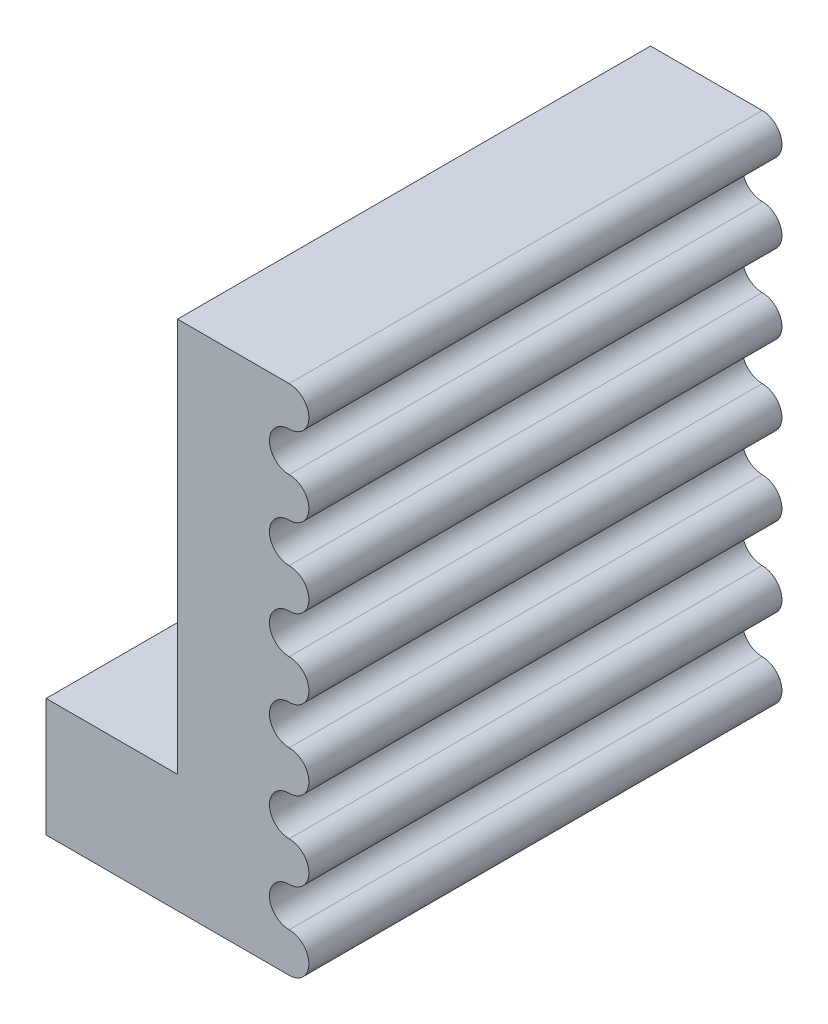
ISO-10303-21;
HEADER;
FILE_DESCRIPTION(('STEP AP214'),'2;1');
FILE_NAME('part.step','',(''),(''),'','','');
FILE_SCHEMA(('AUTOMOTIVE_DESIGN { 1 0 10303 214 1 1 1 1 }'));
ENDSEC;
DATA;
#1=APPLICATION_CONTEXT('core data for automotive mechanical design processes');
#2=APPLICATION_PROTOCOL_DEFINITION('international standard','automotive_design',2000,#1);
#3=PRODUCT_CONTEXT('',#1,'mechanical');
#4=PRODUCT('Part','Part','',(#3));
#5=PRODUCT_RELATED_PRODUCT_CATEGORY('part','',(#4));
#6=PRODUCT_DEFINITION_FORMATION('','',#4);
#7=PRODUCT_DEFINITION_CONTEXT('part definition',#1,'design');
#8=PRODUCT_DEFINITION('design','',#6,#7);
#9=PRODUCT_DEFINITION_SHAPE('','',#8);
#10=(LENGTH_UNIT() NAMED_UNIT(*) SI_UNIT(.MILLI.,.METRE.));
#11=(NAMED_UNIT(*) PLANE_ANGLE_UNIT() SI_UNIT($,.RADIAN.));
#12=(NAMED_UNIT(*) SI_UNIT($,.STERADIAN.) SOLID_ANGLE_UNIT());
#13=UNCERTAINTY_MEASURE_WITH_UNIT(LENGTH_MEASURE(1.E-05),#10,'distance_accuracy_value','');
#14=(GEOMETRIC_REPRESENTATION_CONTEXT(3) GLOBAL_UNCERTAINTY_ASSIGNED_CONTEXT((#13)) GLOBAL_UNIT_ASSIGNED_CONTEXT((#10,
#11,#12)) REPRESENTATION_CONTEXT('',''));
#15=CARTESIAN_POINT('',(0.,0.,0.));
#16=DIRECTION('',(0.,0.,1.));
#17=DIRECTION('',(1.,0.,0.));
#18=AXIS2_PLACEMENT_3D('',#15,#16,#17);
#19=CARTESIAN_POINT('',(9.25000000000023,17.25,18.));
#20=DIRECTION('',(0.,0.,-1.));
#21=DIRECTION('',(-1.,0.,0.));
#22=AXIS2_PLACEMENT_3D('',#19,#20,#21);
#23=CYLINDRICAL_SURFACE('',#22,0.750000000000001);
#24=CARTESIAN_POINT('',(9.25000000000023,17.25,0.));
#25=DIRECTION('',(0.,0.,-1.));
#26=DIRECTION('',(1.,0.,0.));
#27=AXIS2_PLACEMENT_3D('',#24,#25,#26);
#28=CIRCLE('',#27,0.750000000000001);
#29=CARTESIAN_POINT('',(9.25000000000023,16.5,0.));
#30=VERTEX_POINT('',#29);
#31=CARTESIAN_POINT('',(9.25000000000023,18.,0.));
#32=VERTEX_POINT('',#31);
#33=EDGE_CURVE('E191',#30,#32,#28,.T.);
#34=ORIENTED_EDGE('',*,*,#33,.T.);
#35=DIRECTION('',(0.,0.,-1.));
#36=VECTOR('',#35,1.);
#37=CARTESIAN_POINT('',(9.25000000000023,18.,18.));
#38=LINE('',#37,#36);
#39=CARTESIAN_POINT('',(9.25000000000023,18.,18.));
#40=VERTEX_POINT('',#39);
#41=EDGE_CURVE('E11',#40,#32,#38,.T.);
#42=ORIENTED_EDGE('',*,*,#41,.F.);
#43=CARTESIAN_POINT('',(9.25000000000023,17.25,18.));
#44=DIRECTION('',(0.,0.,-1.));
#45=DIRECTION('',(1.,0.,0.));
#46=AXIS2_PLACEMENT_3D('',#43,#44,#45);
#47=CIRCLE('',#46,0.750000000000001);
#48=CARTESIAN_POINT('',(9.25000000000023,16.5,18.));
#49=VERTEX_POINT('',#48);
#50=EDGE_CURVE('E225',#49,#40,#47,.T.);
#51=ORIENTED_EDGE('',*,*,#50,.F.);
#52=DIRECTION('',(0.,0.,-1.));
#53=VECTOR('',#52,1.);
#54=CARTESIAN_POINT('',(9.25000000000023,16.5,18.));
#55=LINE('',#54,#53);
#56=EDGE_CURVE('E187',#49,#30,#55,.T.);
#57=ORIENTED_EDGE('',*,*,#56,.T.);
#58=EDGE_LOOP('',(#34,#42,#51,#57));
#59=FACE_BOUND('',#58,.T.);
#60=ADVANCED_FACE('F35',(#59),#23,.F.);
#61=CARTESIAN_POINT('',(9.25000000000023,18.75,18.));
#62=DIRECTION('',(0.,0.,-1.));
#63=DIRECTION('',(-1.,0.,0.));
#64=AXIS2_PLACEMENT_3D('',#61,#62,#63);
#65=CYLINDRICAL_SURFACE('',#64,0.750000000000001);
#66=CARTESIAN_POINT('',(9.25000000000023,18.75,0.));
#67=DIRECTION('',(0.,0.,1.));
#68=DIRECTION('',(1.,0.,0.));
#69=AXIS2_PLACEMENT_3D('',#66,#67,#68);
#70=CIRCLE('',#69,0.750000000000001);
#71=CARTESIAN_POINT('',(9.25000000000023,19.5,0.));
#72=VERTEX_POINT('',#71);
#73=EDGE_CURVE('E194',#32,#72,#70,.T.);
#74=ORIENTED_EDGE('',*,*,#73,.T.);
#75=DIRECTION('',(0.,0.,-1.));
#76=VECTOR('',#75,1.);
#77=CARTESIAN_POINT('',(9.25000000000023,19.5,18.));
#78=LINE('',#77,#76);
#79=CARTESIAN_POINT('',(9.25000000000023,19.5,18.));
#80=VERTEX_POINT('',#79);
#81=EDGE_CURVE('E43',#80,#72,#78,.T.);
#82=ORIENTED_EDGE('',*,*,#81,.F.);
#83=CARTESIAN_POINT('',(9.25000000000023,18.75,18.));
#84=DIRECTION('',(0.,0.,1.));
#85=DIRECTION('',(1.,0.,0.));
#86=AXIS2_PLACEMENT_3D('',#83,#84,#85);
#87=CIRCLE('',#86,0.750000000000001);
#88=EDGE_CURVE('E124',#40,#80,#87,.T.);
#89=ORIENTED_EDGE('',*,*,#88,.F.);
#90=ORIENTED_EDGE('',*,*,#41,.T.);
#91=EDGE_LOOP('',(#74,#82,#89,#90));
#92=FACE_BOUND('',#91,.T.);
#93=ADVANCED_FACE('F333',(#92),#65,.T.);
#94=CARTESIAN_POINT('',(5.,19.5,18.));
#95=DIRECTION('',(0.,-1.,0.));
#96=DIRECTION('',(0.,0.,-1.));
#97=AXIS2_PLACEMENT_3D('',#94,#95,#96);
#98=PLANE('',#97);
#99=DIRECTION('',(-1.,0.,0.));
#100=VECTOR('',#99,1.);
#101=CARTESIAN_POINT('',(5.,19.5,0.));
#102=LINE('',#101,#100);
#103=CARTESIAN_POINT('',(5.,19.5,0.));
#104=VERTEX_POINT('',#103);
#105=EDGE_CURVE('E196',#72,#104,#102,.T.);
#106=ORIENTED_EDGE('',*,*,#105,.T.);
#107=DIRECTION('',(0.,0.,-1.));
#108=VECTOR('',#107,1.);
#109=CARTESIAN_POINT('',(5.,19.5,18.));
#110=LINE('',#109,#108);
#111=CARTESIAN_POINT('',(5.,19.5,18.));
#112=VERTEX_POINT('',#111);
#113=EDGE_CURVE('E262',#112,#104,#110,.T.);
#114=ORIENTED_EDGE('',*,*,#113,.F.);
#115=DIRECTION('',(-1.,0.,0.));
#116=VECTOR('',#115,1.);
#117=CARTESIAN_POINT('',(5.,19.5,18.));
#118=LINE('',#117,#116);
#119=EDGE_CURVE('E270',#80,#112,#118,.T.);
#120=ORIENTED_EDGE('',*,*,#119,.F.);
#121=ORIENTED_EDGE('',*,*,#81,.T.);
#122=EDGE_LOOP('',(#106,#114,#120,#121));
#123=FACE_BOUND('',#122,.T.);
#124=ADVANCED_FACE('F268',(#123),#98,.F.);
#125=CARTESIAN_POINT('',(5.,4.49999999999993,18.));
#126=DIRECTION('',(1.,0.,0.));
#127=DIRECTION('',(0.,0.,-1.));
#128=AXIS2_PLACEMENT_3D('',#125,#126,#127);
#129=PLANE('',#128);
#130=DIRECTION('',(0.,-1.,0.));
#131=VECTOR('',#130,1.);
#132=CARTESIAN_POINT('',(5.,4.49999999999993,0.));
#133=LINE('',#132,#131);
#134=CARTESIAN_POINT('',(5.,4.49999999999993,0.));
#135=VERTEX_POINT('',#134);
#136=EDGE_CURVE('E198',#104,#135,#133,.T.);
#137=ORIENTED_EDGE('',*,*,#136,.T.);
#138=DIRECTION('',(0.,0.,-1.));
#139=VECTOR('',#138,1.);
#140=CARTESIAN_POINT('',(5.,4.49999999999993,18.));
#141=LINE('',#140,#139);
#142=CARTESIAN_POINT('',(5.,4.49999999999993,18.));
#143=VERTEX_POINT('',#142);
#144=EDGE_CURVE('E259',#143,#135,#141,.T.);
#145=ORIENTED_EDGE('',*,*,#144,.F.);
#146=DIRECTION('',(0.,-1.,0.));
#147=VECTOR('',#146,1.);
#148=CARTESIAN_POINT('',(5.,4.49999999999993,18.));
#149=LINE('',#148,#147);
#150=EDGE_CURVE('E288',#112,#143,#149,.T.);
#151=ORIENTED_EDGE('',*,*,#150,.F.);
#152=ORIENTED_EDGE('',*,*,#113,.T.);
#153=EDGE_LOOP('',(#137,#145,#151,#152));
#154=FACE_BOUND('',#153,.T.);
#155=ADVANCED_FACE('F279',(#154),#129,.F.);
#156=CARTESIAN_POINT('',(0.,4.49999999999993,18.));
#157=DIRECTION('',(0.,-1.,0.));
#158=DIRECTION('',(0.,0.,-1.));
#159=AXIS2_PLACEMENT_3D('',#156,#157,#158);
#160=PLANE('',#159);
#161=DIRECTION('',(-1.,0.,0.));
#162=VECTOR('',#161,1.);
#163=CARTESIAN_POINT('',(0.,4.49999999999993,0.));
#164=LINE('',#163,#162);
#165=CARTESIAN_POINT('',(0.,4.49999999999993,0.));
#166=VERTEX_POINT('',#165);
#167=EDGE_CURVE('E200',#135,#166,#164,.T.);
#168=ORIENTED_EDGE('',*,*,#167,.T.);
#169=DIRECTION('',(0.,0.,-1.));
#170=VECTOR('',#169,1.);
#171=CARTESIAN_POINT('',(0.,4.49999999999993,18.));
#172=LINE('',#171,#170);
#173=CARTESIAN_POINT('',(0.,4.49999999999993,18.));
#174=VERTEX_POINT('',#173);
#175=EDGE_CURVE('E256',#174,#166,#172,.T.);
#176=ORIENTED_EDGE('',*,*,#175,.F.);
#177=DIRECTION('',(-1.,0.,0.));
#178=VECTOR('',#177,1.);
#179=CARTESIAN_POINT('',(0.,4.49999999999993,18.));
#180=LINE('',#179,#178);
#181=EDGE_CURVE('E285',#143,#174,#180,.T.);
#182=ORIENTED_EDGE('',*,*,#181,.F.);
#183=ORIENTED_EDGE('',*,*,#144,.T.);
#184=EDGE_LOOP('',(#168,#176,#182,#183));
#185=FACE_BOUND('',#184,.T.);
#186=ADVANCED_FACE('F283',(#185),#160,.F.);
#187=CARTESIAN_POINT('',(0.,0.,18.));
#188=DIRECTION('',(1.,0.,0.));
#189=DIRECTION('',(0.,0.,-1.));
#190=AXIS2_PLACEMENT_3D('',#187,#188,#189);
#191=PLANE('',#190);
#192=DIRECTION('',(0.,-1.,0.));
#193=VECTOR('',#192,1.);
#194=CARTESIAN_POINT('',(0.,0.,0.));
#195=LINE('',#194,#193);
#196=CARTESIAN_POINT('',(0.,0.,0.));
#197=VERTEX_POINT('',#196);
#198=EDGE_CURVE('E202',#166,#197,#195,.T.);
#199=ORIENTED_EDGE('',*,*,#198,.T.);
#200=DIRECTION('',(0.,0.,-1.));
#201=VECTOR('',#200,1.);
#202=CARTESIAN_POINT('',(0.,0.,18.));
#203=LINE('',#202,#201);
#204=CARTESIAN_POINT('',(0.,0.,18.));
#205=VERTEX_POINT('',#204);
#206=EDGE_CURVE('E253',#205,#197,#203,.T.);
#207=ORIENTED_EDGE('',*,*,#206,.F.);
#208=DIRECTION('',(0.,-1.,0.));
#209=VECTOR('',#208,1.);
#210=CARTESIAN_POINT('',(0.,0.,18.));
#211=LINE('',#210,#209);
#212=EDGE_CURVE('E287',#174,#205,#211,.T.);
#213=ORIENTED_EDGE('',*,*,#212,.F.);
#214=ORIENTED_EDGE('',*,*,#175,.T.);
#215=EDGE_LOOP('',(#199,#207,#213,#214));
#216=FACE_BOUND('',#215,.T.);
#217=ADVANCED_FACE('F346',(#216),#191,.F.);
#218=CARTESIAN_POINT('',(9.25000000000023,0.,18.));
#219=DIRECTION('',(0.,1.,0.));
#220=DIRECTION('',(0.,0.,1.));
#221=AXIS2_PLACEMENT_3D('',#218,#219,#220);
#222=PLANE('',#221);
#223=DIRECTION('',(1.,0.,0.));
#224=VECTOR('',#223,1.);
#225=CARTESIAN_POINT('',(9.25000000000023,0.,0.));
#226=LINE('',#225,#224);
#227=CARTESIAN_POINT('',(9.25000000000023,0.,0.));
#228=VERTEX_POINT('',#227);
#229=EDGE_CURVE('E204',#197,#228,#226,.T.);
#230=ORIENTED_EDGE('',*,*,#229,.T.);
#231=DIRECTION('',(0.,0.,-1.));
#232=VECTOR('',#231,1.);
#233=CARTESIAN_POINT('',(9.25000000000023,0.,18.));
#234=LINE('',#233,#232);
#235=CARTESIAN_POINT('',(9.25000000000023,0.,18.));
#236=VERTEX_POINT('',#235);
#237=EDGE_CURVE('E250',#236,#228,#234,.T.);
#238=ORIENTED_EDGE('',*,*,#237,.F.);
#239=DIRECTION('',(1.,0.,0.));
#240=VECTOR('',#239,1.);
#241=CARTESIAN_POINT('',(9.25000000000023,0.,18.));
#242=LINE('',#241,#240);
#243=EDGE_CURVE('E290',#205,#236,#242,.T.);
#244=ORIENTED_EDGE('',*,*,#243,.F.);
#245=ORIENTED_EDGE('',*,*,#206,.T.);
#246=EDGE_LOOP('',(#230,#238,#244,#245));
#247=FACE_BOUND('',#246,.T.);
#248=ADVANCED_FACE('F349',(#247),#222,.F.);
#249=CARTESIAN_POINT('',(9.25000000000023,0.750000000000001,18.));
#250=DIRECTION('',(0.,0.,-1.));
#251=DIRECTION('',(-1.,0.,0.));
#252=AXIS2_PLACEMENT_3D('',#249,#250,#251);
#253=CYLINDRICAL_SURFACE('',#252,0.750000000000001);
#254=CARTESIAN_POINT('',(9.25000000000023,0.750000000000001,0.));
#255=DIRECTION('',(0.,0.,1.));
#256=DIRECTION('',(1.,0.,0.));
#257=AXIS2_PLACEMENT_3D('',#254,#255,#256);
#258=CIRCLE('',#257,0.750000000000001);
#259=CARTESIAN_POINT('',(9.25000000000023,1.5,0.));
#260=VERTEX_POINT('',#259);
#261=EDGE_CURVE('E206',#228,#260,#258,.T.);
#262=ORIENTED_EDGE('',*,*,#261,.T.);
#263=DIRECTION('',(0.,0.,-1.));
#264=VECTOR('',#263,1.);
#265=CARTESIAN_POINT('',(9.25000000000023,1.5,18.));
#266=LINE('',#265,#264);
#267=CARTESIAN_POINT('',(9.25000000000023,1.5,18.));
#268=VERTEX_POINT('',#267);
#269=EDGE_CURVE('E247',#268,#260,#266,.T.);
#270=ORIENTED_EDGE('',*,*,#269,.F.);
#271=CARTESIAN_POINT('',(9.25000000000023,0.750000000000001,18.));
#272=DIRECTION('',(0.,0.,1.));
#273=DIRECTION('',(1.,0.,0.));
#274=AXIS2_PLACEMENT_3D('',#271,#272,#273);
#275=CIRCLE('',#274,0.750000000000001);
#276=EDGE_CURVE('E296',#236,#268,#275,.T.);
#277=ORIENTED_EDGE('',*,*,#276,.F.);
#278=ORIENTED_EDGE('',*,*,#237,.T.);
#279=EDGE_LOOP('',(#262,#270,#277,#278));
#280=FACE_BOUND('',#279,.T.);
#281=ADVANCED_FACE('F353',(#280),#253,.T.);
#282=CARTESIAN_POINT('',(9.25000000000023,2.25,18.));
#283=DIRECTION('',(0.,0.,-1.));
#284=DIRECTION('',(-1.,0.,0.));
#285=AXIS2_PLACEMENT_3D('',#282,#283,#284);
#286=CYLINDRICAL_SURFACE('',#285,0.750000000000001);
#287=CARTESIAN_POINT('',(9.25000000000023,2.25,0.));
#288=DIRECTION('',(0.,0.,-1.));
#289=DIRECTION('',(1.,0.,0.));
#290=AXIS2_PLACEMENT_3D('',#287,#288,#289);
#291=CIRCLE('',#290,0.750000000000001);
#292=CARTESIAN_POINT('',(9.25000000000023,3.,0.));
#293=VERTEX_POINT('',#292);
#294=EDGE_CURVE('E208',#260,#293,#291,.T.);
#295=ORIENTED_EDGE('',*,*,#294,.T.);
#296=DIRECTION('',(0.,0.,-1.));
#297=VECTOR('',#296,1.);
#298=CARTESIAN_POINT('',(9.25000000000023,3.,18.));
#299=LINE('',#298,#297);
#300=CARTESIAN_POINT('',(9.25000000000023,3.,18.));
#301=VERTEX_POINT('',#300);
#302=EDGE_CURVE('E244',#301,#293,#299,.T.);
#303=ORIENTED_EDGE('',*,*,#302,.F.);
#304=CARTESIAN_POINT('',(9.25000000000023,2.25,18.));
#305=DIRECTION('',(0.,0.,-1.));
#306=DIRECTION('',(1.,0.,0.));
#307=AXIS2_PLACEMENT_3D('',#304,#305,#306);
#308=CIRCLE('',#307,0.750000000000001);
#309=EDGE_CURVE('E298',#268,#301,#308,.T.);
#310=ORIENTED_EDGE('',*,*,#309,.F.);
#311=ORIENTED_EDGE('',*,*,#269,.T.);
#312=EDGE_LOOP('',(#295,#303,#310,#311));
#313=FACE_BOUND('',#312,.T.);
#314=ADVANCED_FACE('F357',(#313),#286,.F.);
#315=CARTESIAN_POINT('',(9.25000000000023,3.75,18.));
#316=DIRECTION('',(0.,0.,-1.));
#317=DIRECTION('',(-1.,0.,0.));
#318=AXIS2_PLACEMENT_3D('',#315,#316,#317);
#319=CYLINDRICAL_SURFACE('',#318,0.75);
#320=CARTESIAN_POINT('',(9.25000000000023,3.75,0.));
#321=DIRECTION('',(0.,0.,1.));
#322=DIRECTION('',(1.,0.,0.));
#323=AXIS2_PLACEMENT_3D('',#320,#321,#322);
#324=CIRCLE('',#323,0.75);
#325=CARTESIAN_POINT('',(9.25000000000023,4.5,0.));
#326=VERTEX_POINT('',#325);
#327=EDGE_CURVE('E210',#293,#326,#324,.T.);
#328=ORIENTED_EDGE('',*,*,#327,.T.);
#329=DIRECTION('',(0.,0.,-1.));
#330=VECTOR('',#329,1.);
#331=CARTESIAN_POINT('',(9.25000000000023,4.5,18.));
#332=LINE('',#331,#330);
#333=CARTESIAN_POINT('',(9.25000000000023,4.5,18.));
#334=VERTEX_POINT('',#333);
#335=EDGE_CURVE('E241',#334,#326,#332,.T.);
#336=ORIENTED_EDGE('',*,*,#335,.F.);
#337=CARTESIAN_POINT('',(9.25000000000023,3.75,18.));
#338=DIRECTION('',(0.,0.,1.));
#339=DIRECTION('',(1.,0.,0.));
#340=AXIS2_PLACEMENT_3D('',#337,#338,#339);
#341=CIRCLE('',#340,0.75);
#342=EDGE_CURVE('E300',#301,#334,#341,.T.);
#343=ORIENTED_EDGE('',*,*,#342,.F.);
#344=ORIENTED_EDGE('',*,*,#302,.T.);
#345=EDGE_LOOP('',(#328,#336,#343,#344));
#346=FACE_BOUND('',#345,.T.);
#347=ADVANCED_FACE('F361',(#346),#319,.T.);
#348=CARTESIAN_POINT('',(9.2500000000002,5.25,18.));
#349=DIRECTION('',(0.,0.,-1.));
#350=DIRECTION('',(-1.,0.,0.));
#351=AXIS2_PLACEMENT_3D('',#348,#349,#350);
#352=CYLINDRICAL_SURFACE('',#351,0.750000000000001);
#353=CARTESIAN_POINT('',(9.2500000000002,5.25,0.));
#354=DIRECTION('',(0.,0.,-1.));
#355=DIRECTION('',(1.,0.,0.));
#356=AXIS2_PLACEMENT_3D('',#353,#354,#355);
#357=CIRCLE('',#356,0.750000000000001);
#358=CARTESIAN_POINT('',(9.25000000000023,6.,0.));
#359=VERTEX_POINT('',#358);
#360=EDGE_CURVE('E212',#326,#359,#357,.T.);
#361=ORIENTED_EDGE('',*,*,#360,.T.);
#362=DIRECTION('',(0.,0.,-1.));
#363=VECTOR('',#362,1.);
#364=CARTESIAN_POINT('',(9.25000000000023,6.,18.));
#365=LINE('',#364,#363);
#366=CARTESIAN_POINT('',(9.25000000000023,6.,18.));
#367=VERTEX_POINT('',#366);
#368=EDGE_CURVE('E238',#367,#359,#365,.T.);
#369=ORIENTED_EDGE('',*,*,#368,.F.);
#370=CARTESIAN_POINT('',(9.2500000000002,5.25,18.));
#371=DIRECTION('',(0.,0.,-1.));
#372=DIRECTION('',(1.,0.,0.));
#373=AXIS2_PLACEMENT_3D('',#370,#371,#372);
#374=CIRCLE('',#373,0.750000000000001);
#375=EDGE_CURVE('E302',#334,#367,#374,.T.);
#376=ORIENTED_EDGE('',*,*,#375,.F.);
#377=ORIENTED_EDGE('',*,*,#335,.T.);
#378=EDGE_LOOP('',(#361,#369,#376,#377));
#379=FACE_BOUND('',#378,.T.);
#380=ADVANCED_FACE('F365',(#379),#352,.F.);
#381=CARTESIAN_POINT('',(9.25000000000023,6.75000000000001,18.));
#382=DIRECTION('',(0.,0.,-1.));
#383=DIRECTION('',(-1.,0.,0.));
#384=AXIS2_PLACEMENT_3D('',#381,#382,#383);
#385=CYLINDRICAL_SURFACE('',#384,0.750000000000001);
#386=CARTESIAN_POINT('',(9.25000000000023,6.75000000000001,0.));
#387=DIRECTION('',(0.,0.,1.));
#388=DIRECTION('',(1.,0.,0.));
#389=AXIS2_PLACEMENT_3D('',#386,#387,#388);
#390=CIRCLE('',#389,0.750000000000001);
#391=CARTESIAN_POINT('',(9.25000000000023,7.50000000000001,0.));
#392=VERTEX_POINT('',#391);
#393=EDGE_CURVE('E214',#359,#392,#390,.T.);
#394=ORIENTED_EDGE('',*,*,#393,.T.);
#395=DIRECTION('',(0.,0.,-1.));
#396=VECTOR('',#395,1.);
#397=CARTESIAN_POINT('',(9.25000000000023,7.50000000000001,18.));
#398=LINE('',#397,#396);
#399=CARTESIAN_POINT('',(9.25000000000023,7.50000000000001,18.));
#400=VERTEX_POINT('',#399);
#401=EDGE_CURVE('E235',#400,#392,#398,.T.);
#402=ORIENTED_EDGE('',*,*,#401,.F.);
#403=CARTESIAN_POINT('',(9.25000000000023,6.75000000000001,18.));
#404=DIRECTION('',(0.,0.,1.));
#405=DIRECTION('',(1.,0.,0.));
#406=AXIS2_PLACEMENT_3D('',#403,#404,#405);
#407=CIRCLE('',#406,0.750000000000001);
#408=EDGE_CURVE('E304',#367,#400,#407,.T.);
#409=ORIENTED_EDGE('',*,*,#408,.F.);
#410=ORIENTED_EDGE('',*,*,#368,.T.);
#411=EDGE_LOOP('',(#394,#402,#409,#410));
#412=FACE_BOUND('',#411,.T.);
#413=ADVANCED_FACE('F369',(#412),#385,.T.);
#414=CARTESIAN_POINT('',(9.25000000000023,8.25000000000001,18.));
#415=DIRECTION('',(0.,0.,-1.));
#416=DIRECTION('',(-1.,0.,0.));
#417=AXIS2_PLACEMENT_3D('',#414,#415,#416);
#418=CYLINDRICAL_SURFACE('',#417,0.750000000000001);
#419=CARTESIAN_POINT('',(9.25000000000023,8.25000000000001,0.));
#420=DIRECTION('',(0.,0.,-1.));
#421=DIRECTION('',(1.,0.,0.));
#422=AXIS2_PLACEMENT_3D('',#419,#420,#421);
#423=CIRCLE('',#422,0.750000000000001);
#424=CARTESIAN_POINT('',(9.25000000000023,9.00000000000001,0.));
#425=VERTEX_POINT('',#424);
#426=EDGE_CURVE('E216',#392,#425,#423,.T.);
#427=ORIENTED_EDGE('',*,*,#426,.T.);
#428=DIRECTION('',(0.,0.,-1.));
#429=VECTOR('',#428,1.);
#430=CARTESIAN_POINT('',(9.25000000000023,9.00000000000001,18.));
#431=LINE('',#430,#429);
#432=CARTESIAN_POINT('',(9.25000000000023,9.00000000000001,18.));
#433=VERTEX_POINT('',#432);
#434=EDGE_CURVE('E232',#433,#425,#431,.T.);
#435=ORIENTED_EDGE('',*,*,#434,.F.);
#436=CARTESIAN_POINT('',(9.25000000000023,8.25000000000001,18.));
#437=DIRECTION('',(0.,0.,-1.));
#438=DIRECTION('',(1.,0.,0.));
#439=AXIS2_PLACEMENT_3D('',#436,#437,#438);
#440=CIRCLE('',#439,0.750000000000001);
#441=EDGE_CURVE('E306',#400,#433,#440,.T.);
#442=ORIENTED_EDGE('',*,*,#441,.F.);
#443=ORIENTED_EDGE('',*,*,#401,.T.);
#444=EDGE_LOOP('',(#427,#435,#442,#443));
#445=FACE_BOUND('',#444,.T.);
#446=ADVANCED_FACE('F373',(#445),#418,.F.);
#447=CARTESIAN_POINT('',(9.25000000000023,9.75000000000001,18.));
#448=DIRECTION('',(0.,0.,-1.));
#449=DIRECTION('',(-1.,0.,0.));
#450=AXIS2_PLACEMENT_3D('',#447,#448,#449);
#451=CYLINDRICAL_SURFACE('',#450,0.750000000000001);
#452=CARTESIAN_POINT('',(9.25000000000023,9.75000000000001,0.));
#453=DIRECTION('',(0.,0.,1.));
#454=DIRECTION('',(1.,0.,0.));
#455=AXIS2_PLACEMENT_3D('',#452,#453,#454);
#456=CIRCLE('',#455,0.750000000000001);
#457=CARTESIAN_POINT('',(9.25000000000023,10.5,0.));
#458=VERTEX_POINT('',#457);
#459=EDGE_CURVE('E218',#425,#458,#456,.T.);
#460=ORIENTED_EDGE('',*,*,#459,.T.);
#461=DIRECTION('',(0.,0.,-1.));
#462=VECTOR('',#461,1.);
#463=CARTESIAN_POINT('',(9.25000000000023,10.5,18.));
#464=LINE('',#463,#462);
#465=CARTESIAN_POINT('',(9.25000000000023,10.5,18.));
#466=VERTEX_POINT('',#465);
#467=EDGE_CURVE('E229',#466,#458,#464,.T.);
#468=ORIENTED_EDGE('',*,*,#467,.F.);
#469=CARTESIAN_POINT('',(9.25000000000023,9.75000000000001,18.));
#470=DIRECTION('',(0.,0.,1.));
#471=DIRECTION('',(1.,0.,0.));
#472=AXIS2_PLACEMENT_3D('',#469,#470,#471);
#473=CIRCLE('',#472,0.750000000000001);
#474=EDGE_CURVE('E308',#433,#466,#473,.T.);
#475=ORIENTED_EDGE('',*,*,#474,.F.);
#476=ORIENTED_EDGE('',*,*,#434,.T.);
#477=EDGE_LOOP('',(#460,#468,#475,#476));
#478=FACE_BOUND('',#477,.T.);
#479=ADVANCED_FACE('F314',(#478),#451,.T.);
#480=CARTESIAN_POINT('',(9.25000000000023,11.25,18.));
#481=DIRECTION('',(0.,0.,-1.));
#482=DIRECTION('',(-1.,0.,0.));
#483=AXIS2_PLACEMENT_3D('',#480,#481,#482);
#484=CYLINDRICAL_SURFACE('',#483,0.750000000000001);
#485=CARTESIAN_POINT('',(9.25000000000023,11.25,0.));
#486=DIRECTION('',(0.,0.,-1.));
#487=DIRECTION('',(1.,0.,0.));
#488=AXIS2_PLACEMENT_3D('',#485,#486,#487);
#489=CIRCLE('',#488,0.750000000000001);
#490=CARTESIAN_POINT('',(9.25000000000023,12.,0.));
#491=VERTEX_POINT('',#490);
#492=EDGE_CURVE('E220',#458,#491,#489,.T.);
#493=ORIENTED_EDGE('',*,*,#492,.T.);
#494=DIRECTION('',(0.,0.,-1.));
#495=VECTOR('',#494,1.);
#496=CARTESIAN_POINT('',(9.25000000000023,12.,18.));
#497=LINE('',#496,#495);
#498=CARTESIAN_POINT('',(9.25000000000023,12.,18.));
#499=VERTEX_POINT('',#498);
#500=EDGE_CURVE('E182',#499,#491,#497,.T.);
#501=ORIENTED_EDGE('',*,*,#500,.F.);
#502=CARTESIAN_POINT('',(9.25000000000023,11.25,18.));
#503=DIRECTION('',(0.,0.,-1.));
#504=DIRECTION('',(1.,0.,0.));
#505=AXIS2_PLACEMENT_3D('',#502,#503,#504);
#506=CIRCLE('',#505,0.750000000000001);
#507=EDGE_CURVE('E173',#466,#499,#506,.T.);
#508=ORIENTED_EDGE('',*,*,#507,.F.);
#509=ORIENTED_EDGE('',*,*,#467,.T.);
#510=EDGE_LOOP('',(#493,#501,#508,#509));
#511=FACE_BOUND('',#510,.T.);
#512=ADVANCED_FACE('F318',(#511),#484,.F.);
#513=CARTESIAN_POINT('',(9.25000000000023,12.75,18.));
#514=DIRECTION('',(0.,0.,-1.));
#515=DIRECTION('',(-1.,0.,0.));
#516=AXIS2_PLACEMENT_3D('',#513,#514,#515);
#517=CYLINDRICAL_SURFACE('',#516,0.750000000000001);
#518=CARTESIAN_POINT('',(9.25000000000023,12.75,0.));
#519=DIRECTION('',(0.,0.,1.));
#520=DIRECTION('',(1.,0.,0.));
#521=AXIS2_PLACEMENT_3D('',#518,#519,#520);
#522=CIRCLE('',#521,0.750000000000001);
#523=CARTESIAN_POINT('',(9.25000000000023,13.5,0.));
#524=VERTEX_POINT('',#523);
#525=EDGE_CURVE('E181',#491,#524,#522,.T.);
#526=ORIENTED_EDGE('',*,*,#525,.T.);
#527=DIRECTION('',(0.,0.,-1.));
#528=VECTOR('',#527,1.);
#529=CARTESIAN_POINT('',(9.25000000000023,13.5,18.));
#530=LINE('',#529,#528);
#531=CARTESIAN_POINT('',(9.25000000000023,13.5,18.));
#532=VERTEX_POINT('',#531);
#533=EDGE_CURVE('E178',#532,#524,#530,.T.);
#534=ORIENTED_EDGE('',*,*,#533,.F.);
#535=CARTESIAN_POINT('',(9.25000000000023,12.75,18.));
#536=DIRECTION('',(0.,0.,1.));
#537=DIRECTION('',(1.,0.,0.));
#538=AXIS2_PLACEMENT_3D('',#535,#536,#537);
#539=CIRCLE('',#538,0.750000000000001);
#540=EDGE_CURVE('E167',#499,#532,#539,.T.);
#541=ORIENTED_EDGE('',*,*,#540,.F.);
#542=ORIENTED_EDGE('',*,*,#500,.T.);
#543=EDGE_LOOP('',(#526,#534,#541,#542));
#544=FACE_BOUND('',#543,.T.);
#545=ADVANCED_FACE('F179',(#544),#517,.T.);
#546=CARTESIAN_POINT('',(9.25000000000023,14.25,18.));
#547=DIRECTION('',(0.,0.,-1.));
#548=DIRECTION('',(-1.,0.,0.));
#549=AXIS2_PLACEMENT_3D('',#546,#547,#548);
#550=CYLINDRICAL_SURFACE('',#549,0.750000000000001);
#551=CARTESIAN_POINT('',(9.25000000000023,14.25,0.));
#552=DIRECTION('',(0.,0.,-1.));
#553=DIRECTION('',(1.,0.,0.));
#554=AXIS2_PLACEMENT_3D('',#551,#552,#553);
#555=CIRCLE('',#554,0.750000000000001);
#556=CARTESIAN_POINT('',(9.25000000000023,15.,0.));
#557=VERTEX_POINT('',#556);
#558=EDGE_CURVE('E110',#524,#557,#555,.T.);
#559=ORIENTED_EDGE('',*,*,#558,.T.);
#560=DIRECTION('',(0.,0.,-1.));
#561=VECTOR('',#560,1.);
#562=CARTESIAN_POINT('',(9.25000000000023,15.,18.));
#563=LINE('',#562,#561);
#564=CARTESIAN_POINT('',(9.25000000000023,15.,18.));
#565=VERTEX_POINT('',#564);
#566=EDGE_CURVE('E183',#565,#557,#563,.T.);
#567=ORIENTED_EDGE('',*,*,#566,.F.);
#568=CARTESIAN_POINT('',(9.25000000000023,14.25,18.));
#569=DIRECTION('',(0.,0.,-1.));
#570=DIRECTION('',(1.,0.,0.));
#571=AXIS2_PLACEMENT_3D('',#568,#569,#570);
#572=CIRCLE('',#571,0.750000000000001);
#573=EDGE_CURVE('E171',#532,#565,#572,.T.);
#574=ORIENTED_EDGE('',*,*,#573,.F.);
#575=ORIENTED_EDGE('',*,*,#533,.T.);
#576=EDGE_LOOP('',(#559,#567,#574,#575));
#577=FACE_BOUND('',#576,.T.);
#578=ADVANCED_FACE('F185',(#577),#550,.F.);
#579=CARTESIAN_POINT('',(9.25000000000023,15.75,18.));
#580=DIRECTION('',(0.,0.,-1.));
#581=DIRECTION('',(-1.,0.,0.));
#582=AXIS2_PLACEMENT_3D('',#579,#580,#581);
#583=CYLINDRICAL_SURFACE('',#582,0.750000000000001);
#584=CARTESIAN_POINT('',(9.25000000000023,15.75,0.));
#585=DIRECTION('',(0.,0.,1.));
#586=DIRECTION('',(1.,0.,0.));
#587=AXIS2_PLACEMENT_3D('',#584,#585,#586);
#588=CIRCLE('',#587,0.750000000000001);
#589=EDGE_CURVE('E116',#557,#30,#588,.T.);
#590=ORIENTED_EDGE('',*,*,#589,.T.);
#591=ORIENTED_EDGE('',*,*,#56,.F.);
#592=CARTESIAN_POINT('',(9.25000000000023,15.75,18.));
#593=DIRECTION('',(0.,0.,1.));
#594=DIRECTION('',(1.,0.,0.));
#595=AXIS2_PLACEMENT_3D('',#592,#593,#594);
#596=CIRCLE('',#595,0.750000000000001);
#597=EDGE_CURVE('E51',#565,#49,#596,.T.);
#598=ORIENTED_EDGE('',*,*,#597,.F.);
#599=ORIENTED_EDGE('',*,*,#566,.T.);
#600=EDGE_LOOP('',(#590,#591,#598,#599));
#601=FACE_BOUND('',#600,.T.);
#602=ADVANCED_FACE('F322',(#601),#583,.T.);
#603=CARTESIAN_POINT('',(9.25000000000023,17.25,18.));
#604=DIRECTION('',(0.,0.,1.));
#605=DIRECTION('',(1.,0.,0.));
#606=AXIS2_PLACEMENT_3D('',#603,#604,#605);
#607=PLANE('',#606);
#608=ORIENTED_EDGE('',*,*,#50,.T.);
#609=ORIENTED_EDGE('',*,*,#88,.T.);
#610=ORIENTED_EDGE('',*,*,#119,.T.);
#611=ORIENTED_EDGE('',*,*,#150,.T.);
#612=ORIENTED_EDGE('',*,*,#181,.T.);
#613=ORIENTED_EDGE('',*,*,#212,.T.);
#614=ORIENTED_EDGE('',*,*,#243,.T.);
#615=ORIENTED_EDGE('',*,*,#276,.T.);
#616=ORIENTED_EDGE('',*,*,#309,.T.);
#617=ORIENTED_EDGE('',*,*,#342,.T.);
#618=ORIENTED_EDGE('',*,*,#375,.T.);
#619=ORIENTED_EDGE('',*,*,#408,.T.);
#620=ORIENTED_EDGE('',*,*,#441,.T.);
#621=ORIENTED_EDGE('',*,*,#474,.T.);
#622=ORIENTED_EDGE('',*,*,#507,.T.);
#623=ORIENTED_EDGE('',*,*,#540,.T.);
#624=ORIENTED_EDGE('',*,*,#573,.T.);
#625=ORIENTED_EDGE('',*,*,#597,.T.);
#626=EDGE_LOOP('',(#608,#609,#610,#611,#612,#613,#614,#615,#616,#617,#618,#619,#620,#621,#622,
#623,#624,#625));
#627=FACE_BOUND('',#626,.T.);
#628=ADVANCED_FACE('F169',(#627),#607,.T.);
#629=CARTESIAN_POINT('',(9.25000000000023,17.25,0.));
#630=DIRECTION('',(0.,0.,1.));
#631=DIRECTION('',(1.,0.,0.));
#632=AXIS2_PLACEMENT_3D('',#629,#630,#631);
#633=PLANE('',#632);
#634=ORIENTED_EDGE('',*,*,#33,.F.);
#635=ORIENTED_EDGE('',*,*,#589,.F.);
#636=ORIENTED_EDGE('',*,*,#558,.F.);
#637=ORIENTED_EDGE('',*,*,#525,.F.);
#638=ORIENTED_EDGE('',*,*,#492,.F.);
#639=ORIENTED_EDGE('',*,*,#459,.F.);
#640=ORIENTED_EDGE('',*,*,#426,.F.);
#641=ORIENTED_EDGE('',*,*,#393,.F.);
#642=ORIENTED_EDGE('',*,*,#360,.F.);
#643=ORIENTED_EDGE('',*,*,#327,.F.);
#644=ORIENTED_EDGE('',*,*,#294,.F.);
#645=ORIENTED_EDGE('',*,*,#261,.F.);
#646=ORIENTED_EDGE('',*,*,#229,.F.);
#647=ORIENTED_EDGE('',*,*,#198,.F.);
#648=ORIENTED_EDGE('',*,*,#167,.F.);
#649=ORIENTED_EDGE('',*,*,#136,.F.);
#650=ORIENTED_EDGE('',*,*,#105,.F.);
#651=ORIENTED_EDGE('',*,*,#73,.F.);
#652=EDGE_LOOP('',(#634,#635,#636,#637,#638,#639,#640,#641,#642,#643,#644,#645,#646,#647,#648,
#649,#650,#651));
#653=FACE_BOUND('',#652,.T.);
#654=ADVANCED_FACE('F274',(#653),#633,.F.);
#655=CLOSED_SHELL('',(#60,#93,#124,#155,#186,#217,#248,#281,#314,#347,#380,#413,#446,#479,#512,
#545,#578,#602,#628,#654));
#656=MANIFOLD_SOLID_BREP('B2',#655);
#657=ADVANCED_BREP_SHAPE_REPRESENTATION('',(#18,#656),#14);
#658=SHAPE_DEFINITION_REPRESENTATION(#9,#657);
ENDSEC;
END-ISO-10303-21;
